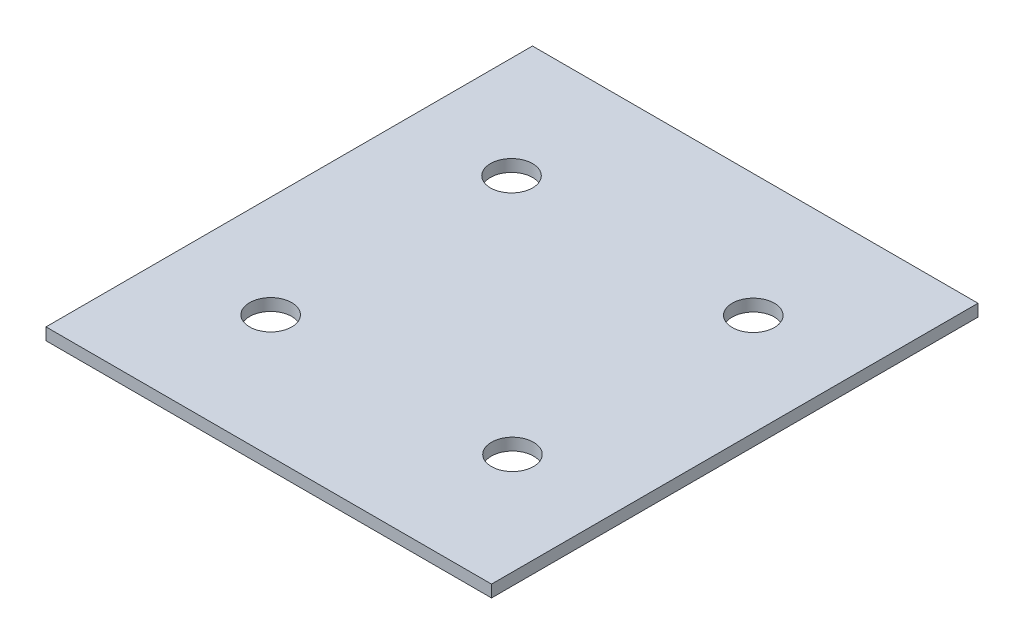
ISO-10303-21;
HEADER;
FILE_DESCRIPTION(('STEP AP214'),'2;1');
FILE_NAME('part.step','',(''),(''),'','','');
FILE_SCHEMA(('AUTOMOTIVE_DESIGN { 1 0 10303 214 1 1 1 1 }'));
ENDSEC;
DATA;
#1=APPLICATION_CONTEXT('core data for automotive mechanical design processes');
#2=APPLICATION_PROTOCOL_DEFINITION('international standard','automotive_design',2000,#1);
#3=PRODUCT_CONTEXT('',#1,'mechanical');
#4=PRODUCT('Part','Part','',(#3));
#5=PRODUCT_RELATED_PRODUCT_CATEGORY('part','',(#4));
#6=PRODUCT_DEFINITION_FORMATION('','',#4);
#7=PRODUCT_DEFINITION_CONTEXT('part definition',#1,'design');
#8=PRODUCT_DEFINITION('design','',#6,#7);
#9=PRODUCT_DEFINITION_SHAPE('','',#8);
#10=(LENGTH_UNIT() NAMED_UNIT(*) SI_UNIT(.MILLI.,.METRE.));
#11=(NAMED_UNIT(*) PLANE_ANGLE_UNIT() SI_UNIT($,.RADIAN.));
#12=(NAMED_UNIT(*) SI_UNIT($,.STERADIAN.) SOLID_ANGLE_UNIT());
#13=UNCERTAINTY_MEASURE_WITH_UNIT(LENGTH_MEASURE(1.E-05),#10,'distance_accuracy_value','');
#14=(GEOMETRIC_REPRESENTATION_CONTEXT(3) GLOBAL_UNCERTAINTY_ASSIGNED_CONTEXT((#13)) GLOBAL_UNIT_ASSIGNED_CONTEXT((#10,
#11,#12)) REPRESENTATION_CONTEXT('',''));
#15=CARTESIAN_POINT('',(0.,0.,0.));
#16=DIRECTION('',(0.,0.,1.));
#17=DIRECTION('',(1.,0.,0.));
#18=AXIS2_PLACEMENT_3D('',#15,#16,#17);
#19=CARTESIAN_POINT('',(-117.475,3.175,491.575795146186));
#20=DIRECTION('',(1.,0.,0.));
#21=DIRECTION('',(0.,0.,-1.));
#22=AXIS2_PLACEMENT_3D('',#19,#20,#21);
#23=PLANE('',#22);
#24=DIRECTION('',(0.,-1.,0.));
#25=VECTOR('',#24,1.);
#26=CARTESIAN_POINT('',(-117.475,3.175,256.54));
#27=LINE('',#26,#25);
#28=CARTESIAN_POINT('',(-117.475,3.175,256.54));
#29=VERTEX_POINT('',#28);
#30=CARTESIAN_POINT('',(-117.475,-3.175,256.54));
#31=VERTEX_POINT('',#30);
#32=EDGE_CURVE('E83',#29,#31,#27,.T.);
#33=ORIENTED_EDGE('',*,*,#32,.F.);
#34=DIRECTION('',(0.,0.,-1.));
#35=VECTOR('',#34,1.);
#36=CARTESIAN_POINT('',(-117.475,3.175,491.575795146186));
#37=LINE('',#36,#35);
#38=CARTESIAN_POINT('',(-117.475,3.175,0.));
#39=VERTEX_POINT('',#38);
#40=EDGE_CURVE('E37',#29,#39,#37,.T.);
#41=ORIENTED_EDGE('',*,*,#40,.T.);
#42=DIRECTION('',(0.,-1.,0.));
#43=VECTOR('',#42,1.);
#44=CARTESIAN_POINT('',(-117.475,3.175,0.));
#45=LINE('',#44,#43);
#46=CARTESIAN_POINT('',(-117.475,-3.175,0.));
#47=VERTEX_POINT('',#46);
#48=EDGE_CURVE('E81',#39,#47,#45,.T.);
#49=ORIENTED_EDGE('',*,*,#48,.T.);
#50=DIRECTION('',(0.,0.,-1.));
#51=VECTOR('',#50,1.);
#52=CARTESIAN_POINT('',(-117.475,-3.175,491.575795146186));
#53=LINE('',#52,#51);
#54=EDGE_CURVE('E72',#31,#47,#53,.T.);
#55=ORIENTED_EDGE('',*,*,#54,.F.);
#56=EDGE_LOOP('',(#33,#41,#49,#55));
#57=FACE_BOUND('',#56,.T.);
#58=ADVANCED_FACE('F33',(#57),#23,.F.);
#59=CARTESIAN_POINT('',(-117.475,-3.175,491.575795146186));
#60=DIRECTION('',(0.,1.,0.));
#61=DIRECTION('',(-1.,0.,0.));
#62=AXIS2_PLACEMENT_3D('',#59,#60,#61);
#63=PLANE('',#62);
#64=CARTESIAN_POINT('',(63.754,-3.17499999999999,191.77));
#65=DIRECTION('',(0.,-1.,0.));
#66=DIRECTION('',(1.,0.,0.));
#67=AXIS2_PLACEMENT_3D('',#64,#65,#66);
#68=CIRCLE('',#67,11.1125);
#69=CARTESIAN_POINT('',(74.8665,-3.17499999999999,191.77));
#70=VERTEX_POINT('',#69);
#71=EDGE_CURVE('E127',#70,#70,#68,.T.);
#72=ORIENTED_EDGE('',*,*,#71,.F.);
#73=EDGE_LOOP('',(#72));
#74=FACE_BOUND('',#73,.T.);
#75=CARTESIAN_POINT('',(63.754,-3.17499999999999,64.77));
#76=DIRECTION('',(0.,-1.,0.));
#77=DIRECTION('',(1.,0.,0.));
#78=AXIS2_PLACEMENT_3D('',#75,#76,#77);
#79=CIRCLE('',#78,11.1125);
#80=CARTESIAN_POINT('',(74.8665,-3.17499999999999,64.77));
#81=VERTEX_POINT('',#80);
#82=EDGE_CURVE('E121',#81,#81,#79,.T.);
#83=ORIENTED_EDGE('',*,*,#82,.F.);
#84=EDGE_LOOP('',(#83));
#85=FACE_BOUND('',#84,.T.);
#86=CARTESIAN_POINT('',(-63.7539999999999,-3.17500000000001,64.77));
#87=DIRECTION('',(0.,-1.,0.));
#88=DIRECTION('',(1.,0.,0.));
#89=AXIS2_PLACEMENT_3D('',#86,#87,#88);
#90=CIRCLE('',#89,11.1125);
#91=CARTESIAN_POINT('',(-52.6414999999999,-3.17500000000001,64.77));
#92=VERTEX_POINT('',#91);
#93=EDGE_CURVE('E115',#92,#92,#90,.T.);
#94=ORIENTED_EDGE('',*,*,#93,.F.);
#95=EDGE_LOOP('',(#94));
#96=FACE_BOUND('',#95,.T.);
#97=CARTESIAN_POINT('',(-63.7539999999999,-3.17500000000001,191.77));
#98=DIRECTION('',(0.,-1.,0.));
#99=DIRECTION('',(1.,0.,0.));
#100=AXIS2_PLACEMENT_3D('',#97,#98,#99);
#101=CIRCLE('',#100,11.1125);
#102=CARTESIAN_POINT('',(-52.6414999999999,-3.17500000000001,191.77));
#103=VERTEX_POINT('',#102);
#104=EDGE_CURVE('E109',#103,#103,#101,.T.);
#105=ORIENTED_EDGE('',*,*,#104,.F.);
#106=EDGE_LOOP('',(#105));
#107=FACE_BOUND('',#106,.T.);
#108=DIRECTION('',(1.,0.,0.));
#109=VECTOR('',#108,1.);
#110=CARTESIAN_POINT('',(-117.475,-3.175,256.54));
#111=LINE('',#110,#109);
#112=CARTESIAN_POINT('',(117.475,-3.175,256.54));
#113=VERTEX_POINT('',#112);
#114=EDGE_CURVE('E42',#31,#113,#111,.T.);
#115=ORIENTED_EDGE('',*,*,#114,.F.);
#116=ORIENTED_EDGE('',*,*,#54,.T.);
#117=DIRECTION('',(1.,0.,0.));
#118=VECTOR('',#117,1.);
#119=CARTESIAN_POINT('',(-117.475,-3.175,0.));
#120=LINE('',#119,#118);
#121=CARTESIAN_POINT('',(117.475,-3.175,0.));
#122=VERTEX_POINT('',#121);
#123=EDGE_CURVE('E94',#47,#122,#120,.T.);
#124=ORIENTED_EDGE('',*,*,#123,.T.);
#125=DIRECTION('',(0.,0.,-1.));
#126=VECTOR('',#125,1.);
#127=CARTESIAN_POINT('',(117.475,-3.175,491.575795146186));
#128=LINE('',#127,#126);
#129=EDGE_CURVE('E103',#113,#122,#128,.T.);
#130=ORIENTED_EDGE('',*,*,#129,.F.);
#131=EDGE_LOOP('',(#115,#116,#124,#130));
#132=FACE_BOUND('',#131,.T.);
#133=ADVANCED_FACE('F134',(#74,#85,#96,#107,#132),#63,.F.);
#134=CARTESIAN_POINT('',(117.475,3.175,491.575795146186));
#135=DIRECTION('',(-1.,0.,0.));
#136=DIRECTION('',(0.,0.,1.));
#137=AXIS2_PLACEMENT_3D('',#134,#135,#136);
#138=PLANE('',#137);
#139=DIRECTION('',(0.,1.,0.));
#140=VECTOR('',#139,1.);
#141=CARTESIAN_POINT('',(117.475,3.175,256.54));
#142=LINE('',#141,#140);
#143=CARTESIAN_POINT('',(117.475,3.175,256.54));
#144=VERTEX_POINT('',#143);
#145=EDGE_CURVE('E11',#113,#144,#142,.T.);
#146=ORIENTED_EDGE('',*,*,#145,.F.);
#147=ORIENTED_EDGE('',*,*,#129,.T.);
#148=DIRECTION('',(0.,1.,0.));
#149=VECTOR('',#148,1.);
#150=CARTESIAN_POINT('',(117.475,3.175,0.));
#151=LINE('',#150,#149);
#152=CARTESIAN_POINT('',(117.475,3.175,0.));
#153=VERTEX_POINT('',#152);
#154=EDGE_CURVE('E104',#122,#153,#151,.T.);
#155=ORIENTED_EDGE('',*,*,#154,.T.);
#156=DIRECTION('',(0.,0.,-1.));
#157=VECTOR('',#156,1.);
#158=CARTESIAN_POINT('',(117.475,3.175,491.575795146186));
#159=LINE('',#158,#157);
#160=EDGE_CURVE('E55',#144,#153,#159,.T.);
#161=ORIENTED_EDGE('',*,*,#160,.F.);
#162=EDGE_LOOP('',(#146,#147,#155,#161));
#163=FACE_BOUND('',#162,.T.);
#164=ADVANCED_FACE('F137',(#163),#138,.F.);
#165=CARTESIAN_POINT('',(-117.475,3.175,491.575795146186));
#166=DIRECTION('',(0.,-1.,0.));
#167=DIRECTION('',(1.,0.,0.));
#168=AXIS2_PLACEMENT_3D('',#165,#166,#167);
#169=PLANE('',#168);
#170=CARTESIAN_POINT('',(63.754,3.175,191.77));
#171=DIRECTION('',(0.,-1.,0.));
#172=DIRECTION('',(1.,0.,0.));
#173=AXIS2_PLACEMENT_3D('',#170,#171,#172);
#174=CIRCLE('',#173,11.1125);
#175=CARTESIAN_POINT('',(74.8665,3.175,191.77));
#176=VERTEX_POINT('',#175);
#177=EDGE_CURVE('E124',#176,#176,#174,.F.);
#178=ORIENTED_EDGE('',*,*,#177,.F.);
#179=EDGE_LOOP('',(#178));
#180=FACE_BOUND('',#179,.T.);
#181=CARTESIAN_POINT('',(63.754,3.175,64.77));
#182=DIRECTION('',(0.,-1.,0.));
#183=DIRECTION('',(1.,0.,0.));
#184=AXIS2_PLACEMENT_3D('',#181,#182,#183);
#185=CIRCLE('',#184,11.1125);
#186=CARTESIAN_POINT('',(74.8665,3.175,64.77));
#187=VERTEX_POINT('',#186);
#188=EDGE_CURVE('E118',#187,#187,#185,.F.);
#189=ORIENTED_EDGE('',*,*,#188,.F.);
#190=EDGE_LOOP('',(#189));
#191=FACE_BOUND('',#190,.T.);
#192=CARTESIAN_POINT('',(-63.7539999999999,3.175,64.77));
#193=DIRECTION('',(0.,-1.,0.));
#194=DIRECTION('',(1.,0.,0.));
#195=AXIS2_PLACEMENT_3D('',#192,#193,#194);
#196=CIRCLE('',#195,11.1125);
#197=CARTESIAN_POINT('',(-52.6414999999999,3.175,64.77));
#198=VERTEX_POINT('',#197);
#199=EDGE_CURVE('E112',#198,#198,#196,.F.);
#200=ORIENTED_EDGE('',*,*,#199,.F.);
#201=EDGE_LOOP('',(#200));
#202=FACE_BOUND('',#201,.T.);
#203=CARTESIAN_POINT('',(-63.7539999999999,3.175,191.77));
#204=DIRECTION('',(0.,-1.,0.));
#205=DIRECTION('',(1.,0.,0.));
#206=AXIS2_PLACEMENT_3D('',#203,#204,#205);
#207=CIRCLE('',#206,11.1125);
#208=CARTESIAN_POINT('',(-52.6414999999999,3.175,191.77));
#209=VERTEX_POINT('',#208);
#210=EDGE_CURVE('E85',#209,#209,#207,.F.);
#211=ORIENTED_EDGE('',*,*,#210,.F.);
#212=EDGE_LOOP('',(#211));
#213=FACE_BOUND('',#212,.T.);
#214=DIRECTION('',(-1.,0.,0.));
#215=VECTOR('',#214,1.);
#216=CARTESIAN_POINT('',(-117.475,3.175,256.54));
#217=LINE('',#216,#215);
#218=EDGE_CURVE('E91',#144,#29,#217,.T.);
#219=ORIENTED_EDGE('',*,*,#218,.F.);
#220=ORIENTED_EDGE('',*,*,#160,.T.);
#221=DIRECTION('',(-1.,0.,0.));
#222=VECTOR('',#221,1.);
#223=CARTESIAN_POINT('',(-117.475,3.175,0.));
#224=LINE('',#223,#222);
#225=EDGE_CURVE('E87',#153,#39,#224,.T.);
#226=ORIENTED_EDGE('',*,*,#225,.T.);
#227=ORIENTED_EDGE('',*,*,#40,.F.);
#228=EDGE_LOOP('',(#219,#220,#226,#227));
#229=FACE_BOUND('',#228,.T.);
#230=ADVANCED_FACE('F88',(#180,#191,#202,#213,#229),#169,.F.);
#231=CARTESIAN_POINT('',(-117.475,-3.175,0.));
#232=DIRECTION('',(0.,0.,1.));
#233=DIRECTION('',(1.,0.,0.));
#234=AXIS2_PLACEMENT_3D('',#231,#232,#233);
#235=PLANE('',#234);
#236=ORIENTED_EDGE('',*,*,#48,.F.);
#237=ORIENTED_EDGE('',*,*,#225,.F.);
#238=ORIENTED_EDGE('',*,*,#154,.F.);
#239=ORIENTED_EDGE('',*,*,#123,.F.);
#240=EDGE_LOOP('',(#236,#237,#238,#239));
#241=FACE_BOUND('',#240,.T.);
#242=ADVANCED_FACE('F93',(#241),#235,.F.);
#243=CARTESIAN_POINT('',(101.854,-3057.525,256.54));
#244=DIRECTION('',(0.,0.,1.));
#245=DIRECTION('',(0.,1.,0.));
#246=AXIS2_PLACEMENT_3D('',#243,#244,#245);
#247=PLANE('',#246);
#248=ORIENTED_EDGE('',*,*,#218,.T.);
#249=ORIENTED_EDGE('',*,*,#32,.T.);
#250=ORIENTED_EDGE('',*,*,#114,.T.);
#251=ORIENTED_EDGE('',*,*,#145,.T.);
#252=EDGE_LOOP('',(#248,#249,#250,#251));
#253=FACE_BOUND('',#252,.T.);
#254=ADVANCED_FACE('F35',(#253),#247,.T.);
#255=CARTESIAN_POINT('',(-63.7539999999999,3.17600000000001,191.77));
#256=DIRECTION('',(0.,-1.,0.));
#257=DIRECTION('',(1.,0.,0.));
#258=AXIS2_PLACEMENT_3D('',#255,#256,#257);
#259=CYLINDRICAL_SURFACE('',#258,11.1125);
#260=CARTESIAN_POINT('',(-52.6414999999999,-3.17500000000001,191.77));
#261=CARTESIAN_POINT('',(-52.6414999999999,-3.10885416666667,191.77));
#262=CARTESIAN_POINT('',(-52.6414999999999,-3.04270833333334,191.77));
#263=CARTESIAN_POINT('',(-52.6414999999999,-2.91041666666667,191.77));
#264=CARTESIAN_POINT('',(-52.6414999999999,-2.84427083333334,191.77));
#265=CARTESIAN_POINT('',(-52.6414999999999,-2.71197916666667,191.77));
#266=CARTESIAN_POINT('',(-52.6414999999999,-2.64583333333334,191.77));
#267=CARTESIAN_POINT('',(-52.6414999999999,-2.51354166666667,191.77));
#268=CARTESIAN_POINT('',(-52.6414999999999,-2.44739583333334,191.77));
#269=CARTESIAN_POINT('',(-52.6414999999999,-2.31510416666667,191.77));
#270=CARTESIAN_POINT('',(-52.6414999999999,-2.24895833333334,191.77));
#271=CARTESIAN_POINT('',(-52.6414999999999,-2.11666666666667,191.77));
#272=CARTESIAN_POINT('',(-52.6414999999999,-2.05052083333334,191.77));
#273=CARTESIAN_POINT('',(-52.6414999999999,-1.91822916666667,191.77));
#274=CARTESIAN_POINT('',(-52.6414999999999,-1.85208333333334,191.77));
#275=CARTESIAN_POINT('',(-52.6414999999999,-1.71979166666667,191.77));
#276=CARTESIAN_POINT('',(-52.6414999999999,-1.65364583333334,191.77));
#277=CARTESIAN_POINT('',(-52.6414999999999,-1.52135416666667,191.77));
#278=CARTESIAN_POINT('',(-52.6414999999999,-1.45520833333334,191.77));
#279=CARTESIAN_POINT('',(-52.6414999999999,-1.32291666666667,191.77));
#280=CARTESIAN_POINT('',(-52.6414999999999,-1.25677083333334,191.77));
#281=CARTESIAN_POINT('',(-52.6414999999999,-1.12447916666667,191.77));
#282=CARTESIAN_POINT('',(-52.6414999999999,-1.05833333333334,191.77));
#283=CARTESIAN_POINT('',(-52.6414999999999,-0.92604166666667,191.77));
#284=CARTESIAN_POINT('',(-52.6414999999999,-0.859895833333337,191.77));
#285=CARTESIAN_POINT('',(-52.6414999999999,-0.72760416666667,191.77));
#286=CARTESIAN_POINT('',(-52.6414999999999,-0.661458333333337,191.77));
#287=CARTESIAN_POINT('',(-52.6414999999999,-0.52916666666667,191.77));
#288=CARTESIAN_POINT('',(-52.6414999999999,-0.463020833333337,191.77));
#289=CARTESIAN_POINT('',(-52.6414999999999,-0.33072916666667,191.77));
#290=CARTESIAN_POINT('',(-52.6414999999999,-0.264583333333337,191.77));
#291=CARTESIAN_POINT('',(-52.6414999999999,-0.13229166666667,191.77));
#292=CARTESIAN_POINT('',(-52.6414999999999,-0.0661458333333364,191.77));
#293=CARTESIAN_POINT('',(-52.6414999999999,0.0661458333333304,191.77));
#294=CARTESIAN_POINT('',(-52.6414999999999,0.132291666666664,191.77));
#295=CARTESIAN_POINT('',(-52.6414999999999,0.264583333333331,191.77));
#296=CARTESIAN_POINT('',(-52.6414999999999,0.330729166666664,191.77));
#297=CARTESIAN_POINT('',(-52.6414999999999,0.463020833333331,191.77));
#298=CARTESIAN_POINT('',(-52.6414999999999,0.529166666666664,191.77));
#299=CARTESIAN_POINT('',(-52.6414999999999,0.661458333333331,191.77));
#300=CARTESIAN_POINT('',(-52.6414999999999,0.727604166666664,191.77));
#301=CARTESIAN_POINT('',(-52.6414999999999,0.859895833333331,191.77));
#302=CARTESIAN_POINT('',(-52.6414999999999,0.926041666666665,191.77));
#303=CARTESIAN_POINT('',(-52.6414999999999,1.05833333333333,191.77));
#304=CARTESIAN_POINT('',(-52.6414999999999,1.12447916666666,191.77));
#305=CARTESIAN_POINT('',(-52.6414999999999,1.25677083333333,191.77));
#306=CARTESIAN_POINT('',(-52.6414999999999,1.32291666666667,191.77));
#307=CARTESIAN_POINT('',(-52.6414999999999,1.45520833333333,191.77));
#308=CARTESIAN_POINT('',(-52.6414999999999,1.52135416666667,191.77));
#309=CARTESIAN_POINT('',(-52.6414999999999,1.65364583333333,191.77));
#310=CARTESIAN_POINT('',(-52.6414999999999,1.71979166666667,191.77));
#311=CARTESIAN_POINT('',(-52.6414999999999,1.85208333333333,191.77));
#312=CARTESIAN_POINT('',(-52.6414999999999,1.91822916666667,191.77));
#313=CARTESIAN_POINT('',(-52.6414999999999,2.05052083333333,191.77));
#314=CARTESIAN_POINT('',(-52.6414999999999,2.11666666666667,191.77));
#315=CARTESIAN_POINT('',(-52.6414999999999,2.24895833333333,191.77));
#316=CARTESIAN_POINT('',(-52.6414999999999,2.31510416666667,191.77));
#317=CARTESIAN_POINT('',(-52.6414999999999,2.44739583333333,191.77));
#318=CARTESIAN_POINT('',(-52.6414999999999,2.51354166666667,191.77));
#319=CARTESIAN_POINT('',(-52.6414999999999,2.64583333333333,191.77));
#320=CARTESIAN_POINT('',(-52.6414999999999,2.71197916666667,191.77));
#321=CARTESIAN_POINT('',(-52.6414999999999,2.84427083333333,191.77));
#322=CARTESIAN_POINT('',(-52.6414999999999,2.91041666666667,191.77));
#323=CARTESIAN_POINT('',(-52.6414999999999,3.04270833333333,191.77));
#324=CARTESIAN_POINT('',(-52.6414999999999,3.10885416666667,191.77));
#325=CARTESIAN_POINT('',(-52.6414999999999,3.175,191.77));
#326=B_SPLINE_CURVE_WITH_KNOTS('',3,(#260,#261,#262,#263,#264,#265,#266,#267,#268,#269,#270,
#271,#272,#273,#274,#275,#276,#277,#278,#279,#280,#281,#282,#283,#284,#285,#286,#287,#288,#289,
#290,#291,#292,#293,#294,#295,#296,#297,#298,#299,#300,#301,#302,#303,#304,#305,#306,#307,#308,
#309,#310,#311,#312,#313,#314,#315,#316,#317,#318,#319,#320,#321,#322,#323,#324,#325),
.UNSPECIFIED.,.F.,.F.,(4,2,2,2,2,2,2,2,2,2,2,2,2,2,2,2,2,2,2,2,2,2,2,2,2,2,2,2,2,2,2,2,4),(0.,
0.1984375,0.396875000000001,0.5953125,0.793750000000001,0.992187500000001,1.190625,1.3890625,
1.5875,1.7859375,1.984375,2.1828125,2.38125,2.5796875,2.778125,2.9765625,3.175,3.3734375,
3.571875,3.7703125,3.96875,4.1671875,4.365625,4.5640625,4.7625,4.96093750000001,
5.15937500000001,5.35781250000001,5.55625000000001,5.75468750000001,5.95312500000001,
6.15156250000001,6.35000000000001),.UNSPECIFIED.);
#327=EDGE_CURVE('BSEAM145',#103,#209,#326,.T.);
#328=ORIENTED_EDGE('',*,*,#104,.T.);
#329=ORIENTED_EDGE('',*,*,#210,.T.);
#330=ORIENTED_EDGE('',*,*,#327,.T.);
#331=ORIENTED_EDGE('',*,*,#327,.F.);
#332=EDGE_LOOP('',(#328,#330,#329,#331));
#333=FACE_BOUND('',#332,.T.);
#334=ADVANCED_FACE('F145',(#333),#259,.F.);
#335=CARTESIAN_POINT('',(-63.7539999999999,3.17600000000001,64.77));
#336=DIRECTION('',(0.,-1.,0.));
#337=DIRECTION('',(1.,0.,0.));
#338=AXIS2_PLACEMENT_3D('',#335,#336,#337);
#339=CYLINDRICAL_SURFACE('',#338,11.1125);
#340=CARTESIAN_POINT('',(-52.6414999999999,-3.17500000000001,64.77));
#341=CARTESIAN_POINT('',(-52.6414999999999,-3.10885416666667,64.77));
#342=CARTESIAN_POINT('',(-52.6414999999999,-3.04270833333334,64.77));
#343=CARTESIAN_POINT('',(-52.6414999999999,-2.91041666666667,64.77));
#344=CARTESIAN_POINT('',(-52.6414999999999,-2.84427083333334,64.77));
#345=CARTESIAN_POINT('',(-52.6414999999999,-2.71197916666667,64.77));
#346=CARTESIAN_POINT('',(-52.6414999999999,-2.64583333333334,64.77));
#347=CARTESIAN_POINT('',(-52.6414999999999,-2.51354166666667,64.77));
#348=CARTESIAN_POINT('',(-52.6414999999999,-2.44739583333334,64.77));
#349=CARTESIAN_POINT('',(-52.6414999999999,-2.31510416666667,64.77));
#350=CARTESIAN_POINT('',(-52.6414999999999,-2.24895833333334,64.77));
#351=CARTESIAN_POINT('',(-52.6414999999999,-2.11666666666667,64.77));
#352=CARTESIAN_POINT('',(-52.6414999999999,-2.05052083333334,64.77));
#353=CARTESIAN_POINT('',(-52.6414999999999,-1.91822916666667,64.77));
#354=CARTESIAN_POINT('',(-52.6414999999999,-1.85208333333334,64.77));
#355=CARTESIAN_POINT('',(-52.6414999999999,-1.71979166666667,64.77));
#356=CARTESIAN_POINT('',(-52.6414999999999,-1.65364583333334,64.77));
#357=CARTESIAN_POINT('',(-52.6414999999999,-1.52135416666667,64.77));
#358=CARTESIAN_POINT('',(-52.6414999999999,-1.45520833333334,64.77));
#359=CARTESIAN_POINT('',(-52.6414999999999,-1.32291666666667,64.77));
#360=CARTESIAN_POINT('',(-52.6414999999999,-1.25677083333334,64.77));
#361=CARTESIAN_POINT('',(-52.6414999999999,-1.12447916666667,64.77));
#362=CARTESIAN_POINT('',(-52.6414999999999,-1.05833333333334,64.77));
#363=CARTESIAN_POINT('',(-52.6414999999999,-0.92604166666667,64.77));
#364=CARTESIAN_POINT('',(-52.6414999999999,-0.859895833333337,64.77));
#365=CARTESIAN_POINT('',(-52.6414999999999,-0.72760416666667,64.77));
#366=CARTESIAN_POINT('',(-52.6414999999999,-0.661458333333337,64.77));
#367=CARTESIAN_POINT('',(-52.6414999999999,-0.52916666666667,64.77));
#368=CARTESIAN_POINT('',(-52.6414999999999,-0.463020833333337,64.77));
#369=CARTESIAN_POINT('',(-52.6414999999999,-0.33072916666667,64.77));
#370=CARTESIAN_POINT('',(-52.6414999999999,-0.264583333333337,64.77));
#371=CARTESIAN_POINT('',(-52.6414999999999,-0.13229166666667,64.77));
#372=CARTESIAN_POINT('',(-52.6414999999999,-0.0661458333333364,64.77));
#373=CARTESIAN_POINT('',(-52.6414999999999,0.0661458333333304,64.77));
#374=CARTESIAN_POINT('',(-52.6414999999999,0.132291666666664,64.77));
#375=CARTESIAN_POINT('',(-52.6414999999999,0.264583333333331,64.77));
#376=CARTESIAN_POINT('',(-52.6414999999999,0.330729166666664,64.77));
#377=CARTESIAN_POINT('',(-52.6414999999999,0.463020833333331,64.77));
#378=CARTESIAN_POINT('',(-52.6414999999999,0.529166666666664,64.77));
#379=CARTESIAN_POINT('',(-52.6414999999999,0.661458333333331,64.77));
#380=CARTESIAN_POINT('',(-52.6414999999999,0.727604166666664,64.77));
#381=CARTESIAN_POINT('',(-52.6414999999999,0.859895833333331,64.77));
#382=CARTESIAN_POINT('',(-52.6414999999999,0.926041666666665,64.77));
#383=CARTESIAN_POINT('',(-52.6414999999999,1.05833333333333,64.77));
#384=CARTESIAN_POINT('',(-52.6414999999999,1.12447916666666,64.77));
#385=CARTESIAN_POINT('',(-52.6414999999999,1.25677083333333,64.77));
#386=CARTESIAN_POINT('',(-52.6414999999999,1.32291666666667,64.77));
#387=CARTESIAN_POINT('',(-52.6414999999999,1.45520833333333,64.77));
#388=CARTESIAN_POINT('',(-52.6414999999999,1.52135416666667,64.77));
#389=CARTESIAN_POINT('',(-52.6414999999999,1.65364583333333,64.77));
#390=CARTESIAN_POINT('',(-52.6414999999999,1.71979166666667,64.77));
#391=CARTESIAN_POINT('',(-52.6414999999999,1.85208333333333,64.77));
#392=CARTESIAN_POINT('',(-52.6414999999999,1.91822916666667,64.77));
#393=CARTESIAN_POINT('',(-52.6414999999999,2.05052083333333,64.77));
#394=CARTESIAN_POINT('',(-52.6414999999999,2.11666666666667,64.77));
#395=CARTESIAN_POINT('',(-52.6414999999999,2.24895833333333,64.77));
#396=CARTESIAN_POINT('',(-52.6414999999999,2.31510416666667,64.77));
#397=CARTESIAN_POINT('',(-52.6414999999999,2.44739583333333,64.77));
#398=CARTESIAN_POINT('',(-52.6414999999999,2.51354166666667,64.77));
#399=CARTESIAN_POINT('',(-52.6414999999999,2.64583333333333,64.77));
#400=CARTESIAN_POINT('',(-52.6414999999999,2.71197916666667,64.77));
#401=CARTESIAN_POINT('',(-52.6414999999999,2.84427083333333,64.77));
#402=CARTESIAN_POINT('',(-52.6414999999999,2.91041666666667,64.77));
#403=CARTESIAN_POINT('',(-52.6414999999999,3.04270833333333,64.77));
#404=CARTESIAN_POINT('',(-52.6414999999999,3.10885416666667,64.77));
#405=CARTESIAN_POINT('',(-52.6414999999999,3.175,64.77));
#406=B_SPLINE_CURVE_WITH_KNOTS('',3,(#340,#341,#342,#343,#344,#345,#346,#347,#348,#349,#350,
#351,#352,#353,#354,#355,#356,#357,#358,#359,#360,#361,#362,#363,#364,#365,#366,#367,#368,#369,
#370,#371,#372,#373,#374,#375,#376,#377,#378,#379,#380,#381,#382,#383,#384,#385,#386,#387,#388,
#389,#390,#391,#392,#393,#394,#395,#396,#397,#398,#399,#400,#401,#402,#403,#404,#405),
.UNSPECIFIED.,.F.,.F.,(4,2,2,2,2,2,2,2,2,2,2,2,2,2,2,2,2,2,2,2,2,2,2,2,2,2,2,2,2,2,2,2,4),(0.,
0.1984375,0.396875000000001,0.5953125,0.793750000000001,0.992187500000001,1.190625,1.3890625,
1.5875,1.7859375,1.984375,2.1828125,2.38125,2.5796875,2.778125,2.9765625,3.175,3.3734375,
3.571875,3.7703125,3.96875,4.1671875,4.365625,4.5640625,4.7625,4.96093750000001,
5.15937500000001,5.35781250000001,5.55625000000001,5.75468750000001,5.95312500000001,
6.15156250000001,6.35000000000001),.UNSPECIFIED.);
#407=EDGE_CURVE('BSEAM148',#92,#198,#406,.T.);
#408=ORIENTED_EDGE('',*,*,#93,.T.);
#409=ORIENTED_EDGE('',*,*,#199,.T.);
#410=ORIENTED_EDGE('',*,*,#407,.T.);
#411=ORIENTED_EDGE('',*,*,#407,.F.);
#412=EDGE_LOOP('',(#408,#410,#409,#411));
#413=FACE_BOUND('',#412,.T.);
#414=ADVANCED_FACE('F148',(#413),#339,.F.);
#415=CARTESIAN_POINT('',(63.754,3.17600000000002,64.77));
#416=DIRECTION('',(0.,-1.,0.));
#417=DIRECTION('',(1.,0.,0.));
#418=AXIS2_PLACEMENT_3D('',#415,#416,#417);
#419=CYLINDRICAL_SURFACE('',#418,11.1125);
#420=CARTESIAN_POINT('',(74.8665,-3.17499999999999,64.77));
#421=CARTESIAN_POINT('',(74.8665,-3.10885416666666,64.77));
#422=CARTESIAN_POINT('',(74.8665,-3.04270833333333,64.77));
#423=CARTESIAN_POINT('',(74.8665,-2.91041666666666,64.77));
#424=CARTESIAN_POINT('',(74.8665,-2.84427083333333,64.77));
#425=CARTESIAN_POINT('',(74.8665,-2.71197916666666,64.77));
#426=CARTESIAN_POINT('',(74.8665,-2.64583333333333,64.77));
#427=CARTESIAN_POINT('',(74.8665,-2.51354166666666,64.77));
#428=CARTESIAN_POINT('',(74.8665,-2.44739583333333,64.77));
#429=CARTESIAN_POINT('',(74.8665,-2.31510416666666,64.77));
#430=CARTESIAN_POINT('',(74.8665,-2.24895833333333,64.77));
#431=CARTESIAN_POINT('',(74.8665,-2.11666666666666,64.77));
#432=CARTESIAN_POINT('',(74.8665,-2.05052083333333,64.77));
#433=CARTESIAN_POINT('',(74.8665,-1.91822916666666,64.77));
#434=CARTESIAN_POINT('',(74.8665,-1.85208333333333,64.77));
#435=CARTESIAN_POINT('',(74.8665,-1.71979166666666,64.77));
#436=CARTESIAN_POINT('',(74.8665,-1.65364583333333,64.77));
#437=CARTESIAN_POINT('',(74.8665,-1.52135416666666,64.77));
#438=CARTESIAN_POINT('',(74.8665,-1.45520833333333,64.77));
#439=CARTESIAN_POINT('',(74.8665,-1.32291666666666,64.77));
#440=CARTESIAN_POINT('',(74.8665,-1.25677083333333,64.77));
#441=CARTESIAN_POINT('',(74.8665,-1.12447916666666,64.77));
#442=CARTESIAN_POINT('',(74.8665,-1.05833333333333,64.77));
#443=CARTESIAN_POINT('',(74.8665,-0.926041666666663,64.77));
#444=CARTESIAN_POINT('',(74.8665,-0.859895833333329,64.77));
#445=CARTESIAN_POINT('',(74.8665,-0.727604166666662,64.77));
#446=CARTESIAN_POINT('',(74.8665,-0.661458333333329,64.77));
#447=CARTESIAN_POINT('',(74.8665,-0.529166666666663,64.77));
#448=CARTESIAN_POINT('',(74.8665,-0.46302083333333,64.77));
#449=CARTESIAN_POINT('',(74.8665,-0.330729166666663,64.77));
#450=CARTESIAN_POINT('',(74.8665,-0.26458333333333,64.77));
#451=CARTESIAN_POINT('',(74.8665,-0.132291666666664,64.77));
#452=CARTESIAN_POINT('',(74.8665,-0.0661458333333302,64.77));
#453=CARTESIAN_POINT('',(74.8665,0.0661458333333363,64.77));
#454=CARTESIAN_POINT('',(74.8665,0.13229166666667,64.77));
#455=CARTESIAN_POINT('',(74.8665,0.264583333333336,64.77));
#456=CARTESIAN_POINT('',(74.8665,0.330729166666669,64.77));
#457=CARTESIAN_POINT('',(74.8665,0.463020833333336,64.77));
#458=CARTESIAN_POINT('',(74.8665,0.529166666666669,64.77));
#459=CARTESIAN_POINT('',(74.8665,0.661458333333336,64.77));
#460=CARTESIAN_POINT('',(74.8665,0.727604166666669,64.77));
#461=CARTESIAN_POINT('',(74.8665,0.859895833333335,64.77));
#462=CARTESIAN_POINT('',(74.8665,0.926041666666668,64.77));
#463=CARTESIAN_POINT('',(74.8665,1.05833333333333,64.77));
#464=CARTESIAN_POINT('',(74.8665,1.12447916666667,64.77));
#465=CARTESIAN_POINT('',(74.8665,1.25677083333333,64.77));
#466=CARTESIAN_POINT('',(74.8665,1.32291666666667,64.77));
#467=CARTESIAN_POINT('',(74.8665,1.45520833333333,64.77));
#468=CARTESIAN_POINT('',(74.8665,1.52135416666667,64.77));
#469=CARTESIAN_POINT('',(74.8665,1.65364583333333,64.77));
#470=CARTESIAN_POINT('',(74.8665,1.71979166666667,64.77));
#471=CARTESIAN_POINT('',(74.8665,1.85208333333333,64.77));
#472=CARTESIAN_POINT('',(74.8665,1.91822916666667,64.77));
#473=CARTESIAN_POINT('',(74.8665,2.05052083333333,64.77));
#474=CARTESIAN_POINT('',(74.8665,2.11666666666667,64.77));
#475=CARTESIAN_POINT('',(74.8665,2.24895833333333,64.77));
#476=CARTESIAN_POINT('',(74.8665,2.31510416666667,64.77));
#477=CARTESIAN_POINT('',(74.8665,2.44739583333333,64.77));
#478=CARTESIAN_POINT('',(74.8665,2.51354166666667,64.77));
#479=CARTESIAN_POINT('',(74.8665,2.64583333333333,64.77));
#480=CARTESIAN_POINT('',(74.8665,2.71197916666667,64.77));
#481=CARTESIAN_POINT('',(74.8665,2.84427083333333,64.77));
#482=CARTESIAN_POINT('',(74.8665,2.91041666666667,64.77));
#483=CARTESIAN_POINT('',(74.8665,3.04270833333333,64.77));
#484=CARTESIAN_POINT('',(74.8665,3.10885416666667,64.77));
#485=CARTESIAN_POINT('',(74.8665,3.175,64.77));
#486=B_SPLINE_CURVE_WITH_KNOTS('',3,(#420,#421,#422,#423,#424,#425,#426,#427,#428,#429,#430,
#431,#432,#433,#434,#435,#436,#437,#438,#439,#440,#441,#442,#443,#444,#445,#446,#447,#448,#449,
#450,#451,#452,#453,#454,#455,#456,#457,#458,#459,#460,#461,#462,#463,#464,#465,#466,#467,#468,
#469,#470,#471,#472,#473,#474,#475,#476,#477,#478,#479,#480,#481,#482,#483,#484,#485),
.UNSPECIFIED.,.F.,.F.,(4,2,2,2,2,2,2,2,2,2,2,2,2,2,2,2,2,2,2,2,2,2,2,2,2,2,2,2,2,2,2,2,4),(0.,
0.1984375,0.396875,0.595312499999999,0.793749999999999,0.992187499999999,1.190625,1.3890625,
1.5875,1.7859375,1.984375,2.1828125,2.38125,2.5796875,2.778125,2.9765625,3.175,3.3734375,
3.571875,3.7703125,3.96874999999999,4.16718749999999,4.36562499999999,4.56406249999999,
4.76249999999999,4.96093749999999,5.15937499999999,5.35781249999999,5.55624999999999,
5.75468749999999,5.95312499999999,6.15156249999999,6.34999999999999),.UNSPECIFIED.);
#487=EDGE_CURVE('BSEAM201',#81,#187,#486,.T.);
#488=ORIENTED_EDGE('',*,*,#82,.T.);
#489=ORIENTED_EDGE('',*,*,#188,.T.);
#490=ORIENTED_EDGE('',*,*,#487,.T.);
#491=ORIENTED_EDGE('',*,*,#487,.F.);
#492=EDGE_LOOP('',(#488,#490,#489,#491));
#493=FACE_BOUND('',#492,.T.);
#494=ADVANCED_FACE('F201',(#493),#419,.F.);
#495=CARTESIAN_POINT('',(63.754,3.17600000000002,191.77));
#496=DIRECTION('',(0.,-1.,0.));
#497=DIRECTION('',(1.,0.,0.));
#498=AXIS2_PLACEMENT_3D('',#495,#496,#497);
#499=CYLINDRICAL_SURFACE('',#498,11.1125);
#500=CARTESIAN_POINT('',(74.8665,-3.17499999999999,191.77));
#501=CARTESIAN_POINT('',(74.8665,-3.10885416666666,191.77));
#502=CARTESIAN_POINT('',(74.8665,-3.04270833333333,191.77));
#503=CARTESIAN_POINT('',(74.8665,-2.91041666666666,191.77));
#504=CARTESIAN_POINT('',(74.8665,-2.84427083333333,191.77));
#505=CARTESIAN_POINT('',(74.8665,-2.71197916666666,191.77));
#506=CARTESIAN_POINT('',(74.8665,-2.64583333333333,191.77));
#507=CARTESIAN_POINT('',(74.8665,-2.51354166666666,191.77));
#508=CARTESIAN_POINT('',(74.8665,-2.44739583333333,191.77));
#509=CARTESIAN_POINT('',(74.8665,-2.31510416666666,191.77));
#510=CARTESIAN_POINT('',(74.8665,-2.24895833333333,191.77));
#511=CARTESIAN_POINT('',(74.8665,-2.11666666666666,191.77));
#512=CARTESIAN_POINT('',(74.8665,-2.05052083333333,191.77));
#513=CARTESIAN_POINT('',(74.8665,-1.91822916666666,191.77));
#514=CARTESIAN_POINT('',(74.8665,-1.85208333333333,191.77));
#515=CARTESIAN_POINT('',(74.8665,-1.71979166666666,191.77));
#516=CARTESIAN_POINT('',(74.8665,-1.65364583333333,191.77));
#517=CARTESIAN_POINT('',(74.8665,-1.52135416666666,191.77));
#518=CARTESIAN_POINT('',(74.8665,-1.45520833333333,191.77));
#519=CARTESIAN_POINT('',(74.8665,-1.32291666666666,191.77));
#520=CARTESIAN_POINT('',(74.8665,-1.25677083333333,191.77));
#521=CARTESIAN_POINT('',(74.8665,-1.12447916666666,191.77));
#522=CARTESIAN_POINT('',(74.8665,-1.05833333333333,191.77));
#523=CARTESIAN_POINT('',(74.8665,-0.926041666666663,191.77));
#524=CARTESIAN_POINT('',(74.8665,-0.859895833333329,191.77));
#525=CARTESIAN_POINT('',(74.8665,-0.727604166666662,191.77));
#526=CARTESIAN_POINT('',(74.8665,-0.661458333333329,191.77));
#527=CARTESIAN_POINT('',(74.8665,-0.529166666666663,191.77));
#528=CARTESIAN_POINT('',(74.8665,-0.46302083333333,191.77));
#529=CARTESIAN_POINT('',(74.8665,-0.330729166666663,191.77));
#530=CARTESIAN_POINT('',(74.8665,-0.26458333333333,191.77));
#531=CARTESIAN_POINT('',(74.8665,-0.132291666666664,191.77));
#532=CARTESIAN_POINT('',(74.8665,-0.0661458333333302,191.77));
#533=CARTESIAN_POINT('',(74.8665,0.0661458333333363,191.77));
#534=CARTESIAN_POINT('',(74.8665,0.13229166666667,191.77));
#535=CARTESIAN_POINT('',(74.8665,0.264583333333336,191.77));
#536=CARTESIAN_POINT('',(74.8665,0.330729166666669,191.77));
#537=CARTESIAN_POINT('',(74.8665,0.463020833333336,191.77));
#538=CARTESIAN_POINT('',(74.8665,0.529166666666669,191.77));
#539=CARTESIAN_POINT('',(74.8665,0.661458333333336,191.77));
#540=CARTESIAN_POINT('',(74.8665,0.727604166666669,191.77));
#541=CARTESIAN_POINT('',(74.8665,0.859895833333335,191.77));
#542=CARTESIAN_POINT('',(74.8665,0.926041666666668,191.77));
#543=CARTESIAN_POINT('',(74.8665,1.05833333333333,191.77));
#544=CARTESIAN_POINT('',(74.8665,1.12447916666667,191.77));
#545=CARTESIAN_POINT('',(74.8665,1.25677083333333,191.77));
#546=CARTESIAN_POINT('',(74.8665,1.32291666666667,191.77));
#547=CARTESIAN_POINT('',(74.8665,1.45520833333333,191.77));
#548=CARTESIAN_POINT('',(74.8665,1.52135416666667,191.77));
#549=CARTESIAN_POINT('',(74.8665,1.65364583333333,191.77));
#550=CARTESIAN_POINT('',(74.8665,1.71979166666667,191.77));
#551=CARTESIAN_POINT('',(74.8665,1.85208333333333,191.77));
#552=CARTESIAN_POINT('',(74.8665,1.91822916666667,191.77));
#553=CARTESIAN_POINT('',(74.8665,2.05052083333333,191.77));
#554=CARTESIAN_POINT('',(74.8665,2.11666666666667,191.77));
#555=CARTESIAN_POINT('',(74.8665,2.24895833333333,191.77));
#556=CARTESIAN_POINT('',(74.8665,2.31510416666667,191.77));
#557=CARTESIAN_POINT('',(74.8665,2.44739583333333,191.77));
#558=CARTESIAN_POINT('',(74.8665,2.51354166666667,191.77));
#559=CARTESIAN_POINT('',(74.8665,2.64583333333333,191.77));
#560=CARTESIAN_POINT('',(74.8665,2.71197916666667,191.77));
#561=CARTESIAN_POINT('',(74.8665,2.84427083333333,191.77));
#562=CARTESIAN_POINT('',(74.8665,2.91041666666667,191.77));
#563=CARTESIAN_POINT('',(74.8665,3.04270833333333,191.77));
#564=CARTESIAN_POINT('',(74.8665,3.10885416666667,191.77));
#565=CARTESIAN_POINT('',(74.8665,3.175,191.77));
#566=B_SPLINE_CURVE_WITH_KNOTS('',3,(#500,#501,#502,#503,#504,#505,#506,#507,#508,#509,#510,
#511,#512,#513,#514,#515,#516,#517,#518,#519,#520,#521,#522,#523,#524,#525,#526,#527,#528,#529,
#530,#531,#532,#533,#534,#535,#536,#537,#538,#539,#540,#541,#542,#543,#544,#545,#546,#547,#548,
#549,#550,#551,#552,#553,#554,#555,#556,#557,#558,#559,#560,#561,#562,#563,#564,#565),
.UNSPECIFIED.,.F.,.F.,(4,2,2,2,2,2,2,2,2,2,2,2,2,2,2,2,2,2,2,2,2,2,2,2,2,2,2,2,2,2,2,2,4),(0.,
0.1984375,0.396875,0.595312499999999,0.793749999999999,0.992187499999999,1.190625,1.3890625,
1.5875,1.7859375,1.984375,2.1828125,2.38125,2.5796875,2.778125,2.9765625,3.175,3.3734375,
3.571875,3.7703125,3.96874999999999,4.16718749999999,4.36562499999999,4.56406249999999,
4.76249999999999,4.96093749999999,5.15937499999999,5.35781249999999,5.55624999999999,
5.75468749999999,5.95312499999999,6.15156249999999,6.34999999999999),.UNSPECIFIED.);
#567=EDGE_CURVE('BSEAM131',#70,#176,#566,.T.);
#568=ORIENTED_EDGE('',*,*,#71,.T.);
#569=ORIENTED_EDGE('',*,*,#177,.T.);
#570=ORIENTED_EDGE('',*,*,#567,.T.);
#571=ORIENTED_EDGE('',*,*,#567,.F.);
#572=EDGE_LOOP('',(#568,#570,#569,#571));
#573=FACE_BOUND('',#572,.T.);
#574=ADVANCED_FACE('F131',(#573),#499,.F.);
#575=CLOSED_SHELL('',(#58,#133,#164,#230,#242,#254,#334,#414,#494,#574));
#576=MANIFOLD_SOLID_BREP('B2',#575);
#577=ADVANCED_BREP_SHAPE_REPRESENTATION('',(#18,#576),#14);
#578=SHAPE_DEFINITION_REPRESENTATION(#9,#577);
ENDSEC;
END-ISO-10303-21;
